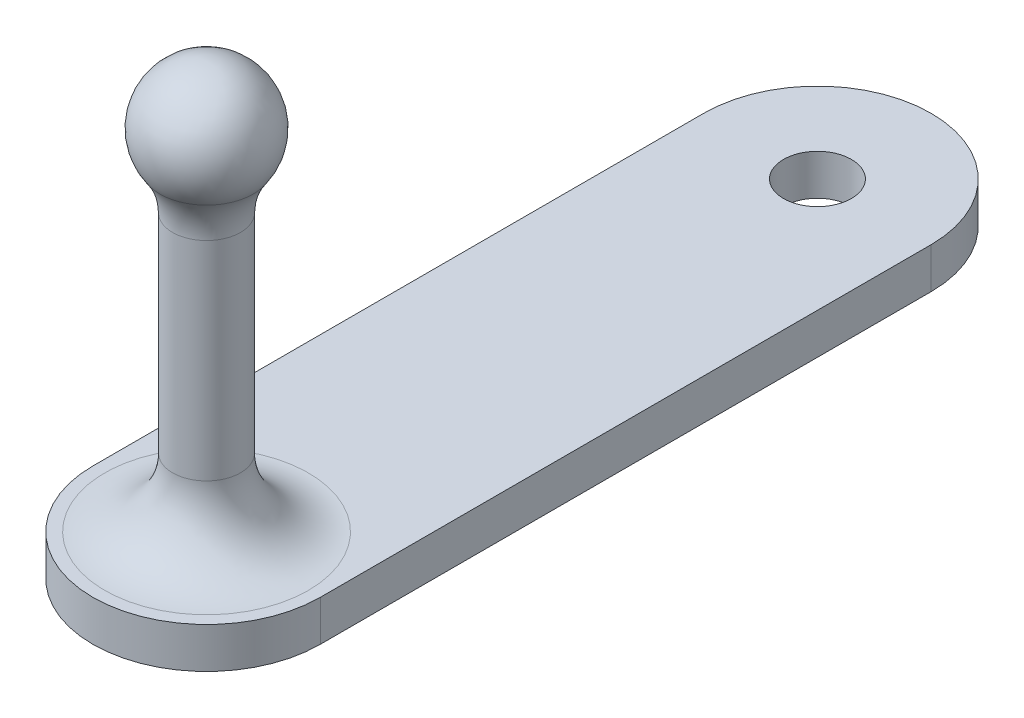
ISO-10303-21;
HEADER;
FILE_DESCRIPTION(('STEP AP214'),'2;1');
FILE_NAME('part.step','',(''),(''),'','','');
FILE_SCHEMA(('AUTOMOTIVE_DESIGN { 1 0 10303 214 1 1 1 1 }'));
ENDSEC;
DATA;
#1=APPLICATION_CONTEXT('core data for automotive mechanical design processes');
#2=APPLICATION_PROTOCOL_DEFINITION('international standard','automotive_design',2000,#1);
#3=PRODUCT_CONTEXT('',#1,'mechanical');
#4=PRODUCT('Part','Part','',(#3));
#5=PRODUCT_RELATED_PRODUCT_CATEGORY('part','',(#4));
#6=PRODUCT_DEFINITION_FORMATION('','',#4);
#7=PRODUCT_DEFINITION_CONTEXT('part definition',#1,'design');
#8=PRODUCT_DEFINITION('design','',#6,#7);
#9=PRODUCT_DEFINITION_SHAPE('','',#8);
#10=(LENGTH_UNIT() NAMED_UNIT(*) SI_UNIT(.MILLI.,.METRE.));
#11=(NAMED_UNIT(*) PLANE_ANGLE_UNIT() SI_UNIT($,.RADIAN.));
#12=(NAMED_UNIT(*) SI_UNIT($,.STERADIAN.) SOLID_ANGLE_UNIT());
#13=UNCERTAINTY_MEASURE_WITH_UNIT(LENGTH_MEASURE(1.E-05),#10,'distance_accuracy_value','');
#14=(GEOMETRIC_REPRESENTATION_CONTEXT(3) GLOBAL_UNCERTAINTY_ASSIGNED_CONTEXT((#13)) GLOBAL_UNIT_ASSIGNED_CONTEXT((#10,
#11,#12)) REPRESENTATION_CONTEXT('',''));
#15=CARTESIAN_POINT('',(0.,0.,0.));
#16=DIRECTION('',(0.,0.,1.));
#17=DIRECTION('',(1.,0.,0.));
#18=AXIS2_PLACEMENT_3D('',#15,#16,#17);
#19=CARTESIAN_POINT('',(0.,0.,0.));
#20=DIRECTION('',(0.,1.,0.));
#21=DIRECTION('',(1.,0.,0.));
#22=AXIS2_PLACEMENT_3D('',#19,#20,#21);
#23=SPHERICAL_SURFACE('',#22,4.25);
#24=CARTESIAN_POINT('',(0.,-2.48756035858805,0.));
#25=DIRECTION('',(0.,1.,0.));
#26=DIRECTION('',(-1.,0.,0.));
#27=AXIS2_PLACEMENT_3D('',#24,#25,#26);
#28=CIRCLE('',#27,3.44594594594594);
#29=CARTESIAN_POINT('',(-3.44594594594594,-2.48756035858805,0.));
#30=VERTEX_POINT('',#29);
#31=EDGE_CURVE('E136',#30,#30,#28,.T.);
#32=ORIENTED_EDGE('',*,*,#31,.T.);
#33=EDGE_LOOP('',(#32));
#34=FACE_BOUND('',#33,.T.);
#35=ADVANCED_FACE('F45',(#34),#23,.T.);
#36=CARTESIAN_POINT('',(0.,4.25,0.));
#37=DIRECTION('',(0.,1.,0.));
#38=DIRECTION('',(-1.,0.,0.));
#39=AXIS2_PLACEMENT_3D('',#36,#37,#38);
#40=CYLINDRICAL_SURFACE('',#39,2.5);
#41=CARTESIAN_POINT('',(0.,-5.41410195692693,0.));
#42=DIRECTION('',(0.,1.,0.));
#43=DIRECTION('',(-1.,0.,0.));
#44=AXIS2_PLACEMENT_3D('',#41,#42,#43);
#45=CIRCLE('',#44,2.5);
#46=CARTESIAN_POINT('',(-2.5,-5.41410195692693,0.));
#47=VERTEX_POINT('',#46);
#48=EDGE_CURVE('E55',#47,#47,#45,.F.);
#49=ORIENTED_EDGE('',*,*,#48,.T.);
#50=EDGE_LOOP('',(#49));
#51=FACE_BOUND('',#50,.T.);
#52=CARTESIAN_POINT('',(0.,-20.75,0.));
#53=DIRECTION('',(0.,-1.,0.));
#54=DIRECTION('',(1.,0.,0.));
#55=AXIS2_PLACEMENT_3D('',#52,#53,#54);
#56=CIRCLE('',#55,2.5);
#57=CARTESIAN_POINT('',(2.5,-20.75,0.));
#58=VERTEX_POINT('',#57);
#59=EDGE_CURVE('E140',#58,#58,#56,.F.);
#60=ORIENTED_EDGE('',*,*,#59,.T.);
#61=EDGE_LOOP('',(#60));
#62=FACE_BOUND('',#61,.T.);
#63=ADVANCED_FACE('F147',(#51,#62),#40,.T.);
#64=CARTESIAN_POINT('',(0.,-28.75,-45.));
#65=DIRECTION('',(0.,-1.,0.));
#66=DIRECTION('',(1.,0.,0.));
#67=AXIS2_PLACEMENT_3D('',#64,#65,#66);
#68=PLANE('',#67);
#69=CARTESIAN_POINT('',(0.,-28.75,-45.));
#70=DIRECTION('',(0.,-1.,0.));
#71=DIRECTION('',(1.,0.,0.));
#72=AXIS2_PLACEMENT_3D('',#69,#70,#71);
#73=CIRCLE('',#72,8.37828465167214);
#74=CARTESIAN_POINT('',(-8.37828465167213,-28.75,-45.));
#75=VERTEX_POINT('',#74);
#76=CARTESIAN_POINT('',(8.37828465167215,-28.75,-45.));
#77=VERTEX_POINT('',#76);
#78=EDGE_CURVE('E100',#75,#77,#73,.T.);
#79=ORIENTED_EDGE('',*,*,#78,.T.);
#80=DIRECTION('',(0.,0.,1.));
#81=VECTOR('',#80,1.);
#82=CARTESIAN_POINT('',(8.37828465167215,-28.75,-45.));
#83=LINE('',#82,#81);
#84=CARTESIAN_POINT('',(8.37828465167215,-28.75,0.));
#85=VERTEX_POINT('',#84);
#86=EDGE_CURVE('E94',#77,#85,#83,.T.);
#87=ORIENTED_EDGE('',*,*,#86,.T.);
#88=CARTESIAN_POINT('',(0.,-28.75,0.));
#89=DIRECTION('',(0.,-1.,0.));
#90=DIRECTION('',(1.,0.,0.));
#91=AXIS2_PLACEMENT_3D('',#88,#89,#90);
#92=CIRCLE('',#91,8.37828465167214);
#93=CARTESIAN_POINT('',(-8.37828465167214,-28.75,0.));
#94=VERTEX_POINT('',#93);
#95=EDGE_CURVE('E98',#85,#94,#92,.T.);
#96=ORIENTED_EDGE('',*,*,#95,.T.);
#97=DIRECTION('',(0.,0.,-1.));
#98=VECTOR('',#97,1.);
#99=CARTESIAN_POINT('',(-8.37828465167213,-28.75,-45.));
#100=LINE('',#99,#98);
#101=EDGE_CURVE('E63',#94,#75,#100,.T.);
#102=ORIENTED_EDGE('',*,*,#101,.T.);
#103=EDGE_LOOP('',(#79,#87,#96,#102));
#104=FACE_BOUND('',#103,.T.);
#105=CARTESIAN_POINT('',(0.,-28.75,-45.));
#106=DIRECTION('',(0.,-1.,0.));
#107=DIRECTION('',(1.,0.,0.));
#108=AXIS2_PLACEMENT_3D('',#105,#106,#107);
#109=CIRCLE('',#108,2.5);
#110=CARTESIAN_POINT('',(2.50000000000001,-28.75,-45.));
#111=VERTEX_POINT('',#110);
#112=EDGE_CURVE('E123',#111,#111,#109,.T.);
#113=ORIENTED_EDGE('',*,*,#112,.F.);
#114=EDGE_LOOP('',(#113));
#115=FACE_BOUND('',#114,.T.);
#116=ADVANCED_FACE('F95',(#104,#115),#68,.T.);
#117=CARTESIAN_POINT('',(0.,-25.75,-45.));
#118=DIRECTION('',(0.,-1.,0.));
#119=DIRECTION('',(1.,0.,0.));
#120=AXIS2_PLACEMENT_3D('',#117,#118,#119);
#121=PLANE('',#120);
#122=CARTESIAN_POINT('',(0.,-25.75,0.));
#123=DIRECTION('',(0.,-1.,0.));
#124=DIRECTION('',(1.,0.,0.));
#125=AXIS2_PLACEMENT_3D('',#122,#123,#124);
#126=CIRCLE('',#125,7.5);
#127=CARTESIAN_POINT('',(7.5,-25.75,0.));
#128=VERTEX_POINT('',#127);
#129=EDGE_CURVE('E11',#128,#128,#126,.T.);
#130=ORIENTED_EDGE('',*,*,#129,.T.);
#131=EDGE_LOOP('',(#130));
#132=FACE_BOUND('',#131,.T.);
#133=CARTESIAN_POINT('',(0.,-25.75,-45.));
#134=DIRECTION('',(0.,-1.,0.));
#135=DIRECTION('',(1.,0.,0.));
#136=AXIS2_PLACEMENT_3D('',#133,#134,#135);
#137=CIRCLE('',#136,8.37828465167214);
#138=CARTESIAN_POINT('',(-8.37828465167213,-25.75,-45.));
#139=VERTEX_POINT('',#138);
#140=CARTESIAN_POINT('',(8.37828465167215,-25.75,-45.));
#141=VERTEX_POINT('',#140);
#142=EDGE_CURVE('E119',#139,#141,#137,.T.);
#143=ORIENTED_EDGE('',*,*,#142,.F.);
#144=DIRECTION('',(0.,0.,-1.));
#145=VECTOR('',#144,1.);
#146=CARTESIAN_POINT('',(-8.37828465167213,-25.75,-45.));
#147=LINE('',#146,#145);
#148=CARTESIAN_POINT('',(-8.37828465167214,-25.75,0.));
#149=VERTEX_POINT('',#148);
#150=EDGE_CURVE('E86',#149,#139,#147,.T.);
#151=ORIENTED_EDGE('',*,*,#150,.F.);
#152=CARTESIAN_POINT('',(0.,-25.75,0.));
#153=DIRECTION('',(0.,-1.,0.));
#154=DIRECTION('',(1.,0.,0.));
#155=AXIS2_PLACEMENT_3D('',#152,#153,#154);
#156=CIRCLE('',#155,8.37828465167214);
#157=CARTESIAN_POINT('',(8.37828465167215,-25.75,0.));
#158=VERTEX_POINT('',#157);
#159=EDGE_CURVE('E80',#158,#149,#156,.T.);
#160=ORIENTED_EDGE('',*,*,#159,.F.);
#161=DIRECTION('',(0.,0.,1.));
#162=VECTOR('',#161,1.);
#163=CARTESIAN_POINT('',(8.37828465167215,-25.75,-45.));
#164=LINE('',#163,#162);
#165=EDGE_CURVE('E106',#141,#158,#164,.T.);
#166=ORIENTED_EDGE('',*,*,#165,.F.);
#167=EDGE_LOOP('',(#143,#151,#160,#166));
#168=FACE_BOUND('',#167,.T.);
#169=CARTESIAN_POINT('',(0.,-25.75,-45.));
#170=DIRECTION('',(0.,-1.,0.));
#171=DIRECTION('',(1.,0.,0.));
#172=AXIS2_PLACEMENT_3D('',#169,#170,#171);
#173=CIRCLE('',#172,2.5);
#174=CARTESIAN_POINT('',(2.50000000000001,-25.75,-45.));
#175=VERTEX_POINT('',#174);
#176=EDGE_CURVE('E189',#175,#175,#173,.T.);
#177=ORIENTED_EDGE('',*,*,#176,.T.);
#178=EDGE_LOOP('',(#177));
#179=FACE_BOUND('',#178,.T.);
#180=ADVANCED_FACE('F167',(#132,#168,#179),#121,.F.);
#181=CARTESIAN_POINT('',(0.,-28.75,-45.));
#182=DIRECTION('',(0.,1.,0.));
#183=DIRECTION('',(-1.,0.,0.));
#184=AXIS2_PLACEMENT_3D('',#181,#182,#183);
#185=CYLINDRICAL_SURFACE('',#184,8.37828465167214);
#186=ORIENTED_EDGE('',*,*,#142,.T.);
#187=DIRECTION('',(0.,1.,0.));
#188=VECTOR('',#187,1.);
#189=CARTESIAN_POINT('',(8.37828465167215,-28.75,-45.));
#190=LINE('',#189,#188);
#191=EDGE_CURVE('E108',#77,#141,#190,.T.);
#192=ORIENTED_EDGE('',*,*,#191,.F.);
#193=ORIENTED_EDGE('',*,*,#78,.F.);
#194=DIRECTION('',(0.,1.,0.));
#195=VECTOR('',#194,1.);
#196=CARTESIAN_POINT('',(-8.37828465167213,-28.75,-45.));
#197=LINE('',#196,#195);
#198=EDGE_CURVE('E115',#75,#139,#197,.T.);
#199=ORIENTED_EDGE('',*,*,#198,.T.);
#200=EDGE_LOOP('',(#186,#192,#193,#199));
#201=FACE_BOUND('',#200,.T.);
#202=ADVANCED_FACE('F164',(#201),#185,.T.);
#203=CARTESIAN_POINT('',(8.37828465167215,-28.75,-45.));
#204=DIRECTION('',(-1.,0.,0.));
#205=DIRECTION('',(0.,-1.,0.));
#206=AXIS2_PLACEMENT_3D('',#203,#204,#205);
#207=PLANE('',#206);
#208=ORIENTED_EDGE('',*,*,#165,.T.);
#209=DIRECTION('',(0.,1.,0.));
#210=VECTOR('',#209,1.);
#211=CARTESIAN_POINT('',(8.37828465167215,-28.75,0.));
#212=LINE('',#211,#210);
#213=EDGE_CURVE('E104',#85,#158,#212,.T.);
#214=ORIENTED_EDGE('',*,*,#213,.F.);
#215=ORIENTED_EDGE('',*,*,#86,.F.);
#216=ORIENTED_EDGE('',*,*,#191,.T.);
#217=EDGE_LOOP('',(#208,#214,#215,#216));
#218=FACE_BOUND('',#217,.T.);
#219=ADVANCED_FACE('F105',(#218),#207,.F.);
#220=CARTESIAN_POINT('',(0.,-28.75,0.));
#221=DIRECTION('',(0.,1.,0.));
#222=DIRECTION('',(-1.,0.,0.));
#223=AXIS2_PLACEMENT_3D('',#220,#221,#222);
#224=CYLINDRICAL_SURFACE('',#223,8.37828465167214);
#225=ORIENTED_EDGE('',*,*,#159,.T.);
#226=DIRECTION('',(0.,1.,0.));
#227=VECTOR('',#226,1.);
#228=CARTESIAN_POINT('',(-8.37828465167214,-28.75,0.));
#229=LINE('',#228,#227);
#230=EDGE_CURVE('E109',#94,#149,#229,.T.);
#231=ORIENTED_EDGE('',*,*,#230,.F.);
#232=ORIENTED_EDGE('',*,*,#95,.F.);
#233=ORIENTED_EDGE('',*,*,#213,.T.);
#234=EDGE_LOOP('',(#225,#231,#232,#233));
#235=FACE_BOUND('',#234,.T.);
#236=ADVANCED_FACE('F111',(#235),#224,.T.);
#237=CARTESIAN_POINT('',(-8.37828465167213,-28.75,-45.));
#238=DIRECTION('',(1.,0.,0.));
#239=DIRECTION('',(0.,1.,0.));
#240=AXIS2_PLACEMENT_3D('',#237,#238,#239);
#241=PLANE('',#240);
#242=ORIENTED_EDGE('',*,*,#150,.T.);
#243=ORIENTED_EDGE('',*,*,#198,.F.);
#244=ORIENTED_EDGE('',*,*,#101,.F.);
#245=ORIENTED_EDGE('',*,*,#230,.T.);
#246=EDGE_LOOP('',(#242,#243,#244,#245));
#247=FACE_BOUND('',#246,.T.);
#248=ADVANCED_FACE('F173',(#247),#241,.F.);
#249=CARTESIAN_POINT('',(0.,-28.75,-45.));
#250=DIRECTION('',(0.,1.,0.));
#251=DIRECTION('',(-1.,0.,0.));
#252=AXIS2_PLACEMENT_3D('',#249,#250,#251);
#253=CYLINDRICAL_SURFACE('',#252,2.5);
#254=ORIENTED_EDGE('',*,*,#112,.T.);
#255=EDGE_LOOP('',(#254));
#256=FACE_BOUND('',#255,.T.);
#257=ORIENTED_EDGE('',*,*,#176,.F.);
#258=EDGE_LOOP('',(#257));
#259=FACE_BOUND('',#258,.T.);
#260=ADVANCED_FACE('F153',(#256,#259),#253,.F.);
#261=CARTESIAN_POINT('',(0.,-5.41410195692693,0.));
#262=DIRECTION('',(0.,1.,0.));
#263=DIRECTION('',(-1.,0.,0.));
#264=AXIS2_PLACEMENT_3D('',#261,#262,#263);
#265=TOROIDAL_SURFACE('',#264,7.5,5.);
#266=ORIENTED_EDGE('',*,*,#48,.F.);
#267=EDGE_LOOP('',(#266));
#268=FACE_BOUND('',#267,.T.);
#269=ORIENTED_EDGE('',*,*,#31,.F.);
#270=EDGE_LOOP('',(#269));
#271=FACE_BOUND('',#270,.T.);
#272=ADVANCED_FACE('F150',(#268,#271),#265,.F.);
#273=CARTESIAN_POINT('',(0.,-20.75,0.));
#274=DIRECTION('',(0.,-1.,0.));
#275=DIRECTION('',(1.,0.,0.));
#276=AXIS2_PLACEMENT_3D('',#273,#274,#275);
#277=TOROIDAL_SURFACE('',#276,7.5,5.);
#278=ORIENTED_EDGE('',*,*,#129,.F.);
#279=EDGE_LOOP('',(#278));
#280=FACE_BOUND('',#279,.T.);
#281=ORIENTED_EDGE('',*,*,#59,.F.);
#282=EDGE_LOOP('',(#281));
#283=FACE_BOUND('',#282,.T.);
#284=ADVANCED_FACE('F47',(#280,#283),#277,.F.);
#285=CLOSED_SHELL('',(#35,#63,#116,#180,#202,#219,#236,#248,#260,#272,#284));
#286=MANIFOLD_SOLID_BREP('B2',#285);
#287=ADVANCED_BREP_SHAPE_REPRESENTATION('',(#18,#286),#14);
#288=SHAPE_DEFINITION_REPRESENTATION(#9,#287);
ENDSEC;
END-ISO-10303-21;
